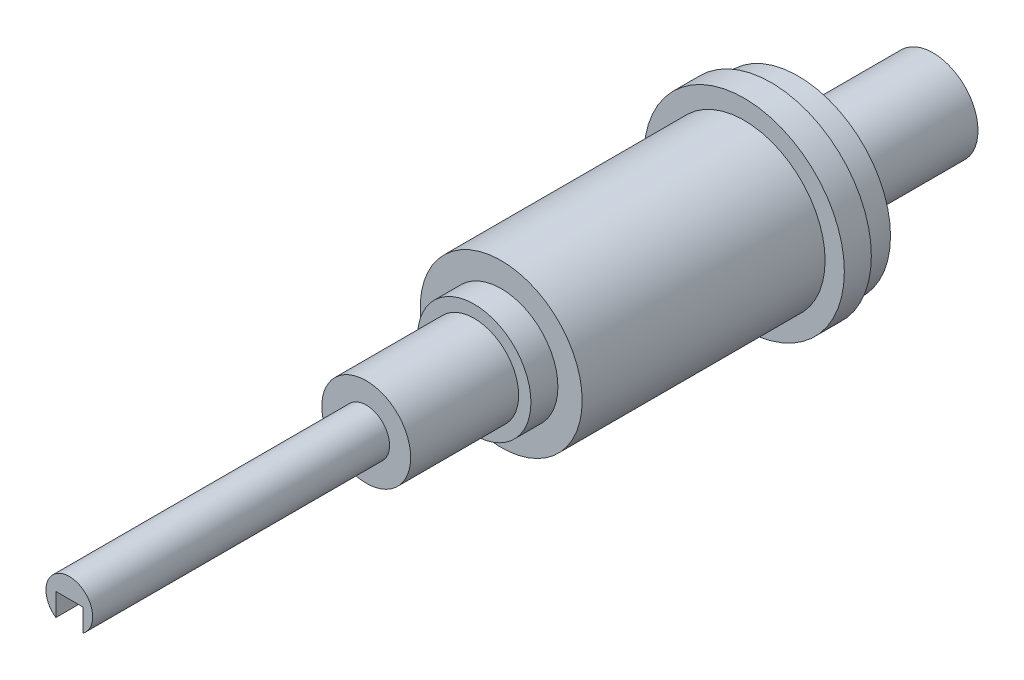
ISO-10303-21;
HEADER;
FILE_DESCRIPTION(('STEP AP214'),'2;1');
FILE_NAME('part.step','',(''),(''),'','','');
FILE_SCHEMA(('AUTOMOTIVE_DESIGN { 1 0 10303 214 1 1 1 1 }'));
ENDSEC;
DATA;
#1=APPLICATION_CONTEXT('core data for automotive mechanical design processes');
#2=APPLICATION_PROTOCOL_DEFINITION('international standard','automotive_design',2000,#1);
#3=PRODUCT_CONTEXT('',#1,'mechanical');
#4=PRODUCT('Part','Part','',(#3));
#5=PRODUCT_RELATED_PRODUCT_CATEGORY('part','',(#4));
#6=PRODUCT_DEFINITION_FORMATION('','',#4);
#7=PRODUCT_DEFINITION_CONTEXT('part definition',#1,'design');
#8=PRODUCT_DEFINITION('design','',#6,#7);
#9=PRODUCT_DEFINITION_SHAPE('','',#8);
#10=(LENGTH_UNIT() NAMED_UNIT(*) SI_UNIT(.MILLI.,.METRE.));
#11=(NAMED_UNIT(*) PLANE_ANGLE_UNIT() SI_UNIT($,.RADIAN.));
#12=(NAMED_UNIT(*) SI_UNIT($,.STERADIAN.) SOLID_ANGLE_UNIT());
#13=UNCERTAINTY_MEASURE_WITH_UNIT(LENGTH_MEASURE(1.E-05),#10,'distance_accuracy_value','');
#14=(GEOMETRIC_REPRESENTATION_CONTEXT(3) GLOBAL_UNCERTAINTY_ASSIGNED_CONTEXT((#13)) GLOBAL_UNIT_ASSIGNED_CONTEXT((#10,
#11,#12)) REPRESENTATION_CONTEXT('',''));
#15=CARTESIAN_POINT('',(0.,0.,0.));
#16=DIRECTION('',(0.,0.,1.));
#17=DIRECTION('',(1.,0.,0.));
#18=AXIS2_PLACEMENT_3D('',#15,#16,#17);
#19=CARTESIAN_POINT('',(0.,0.,0.));
#20=DIRECTION('',(0.,0.,1.));
#21=DIRECTION('',(1.,0.,0.));
#22=AXIS2_PLACEMENT_3D('',#19,#20,#21);
#23=CYLINDRICAL_SURFACE('',#22,19.05);
#24=CARTESIAN_POINT('',(0.,0.,-158.75));
#25=DIRECTION('',(0.,0.,1.));
#26=DIRECTION('',(1.,0.,0.));
#27=AXIS2_PLACEMENT_3D('',#24,#25,#26);
#28=CIRCLE('',#27,19.05);
#29=CARTESIAN_POINT('',(19.05,0.,-158.75));
#30=VERTEX_POINT('',#29);
#31=EDGE_CURVE('E198',#30,#30,#28,.T.);
#32=ORIENTED_EDGE('',*,*,#31,.T.);
#33=EDGE_LOOP('',(#32));
#34=FACE_BOUND('',#33,.T.);
#35=CARTESIAN_POINT('',(0.,0.,-101.6));
#36=DIRECTION('',(0.,0.,1.));
#37=DIRECTION('',(1.,0.,0.));
#38=AXIS2_PLACEMENT_3D('',#35,#36,#37);
#39=CIRCLE('',#38,19.05);
#40=CARTESIAN_POINT('',(19.05,0.,-101.6));
#41=VERTEX_POINT('',#40);
#42=EDGE_CURVE('E202',#41,#41,#39,.T.);
#43=ORIENTED_EDGE('',*,*,#42,.F.);
#44=EDGE_LOOP('',(#43));
#45=FACE_BOUND('',#44,.T.);
#46=CARTESIAN_POINT('',(0.,0.,-152.4));
#47=DIRECTION('',(0.,0.,1.));
#48=DIRECTION('',(1.,0.,0.));
#49=AXIS2_PLACEMENT_3D('',#46,#47,#48);
#50=CIRCLE('',#49,19.05);
#51=CARTESIAN_POINT('',(-3.17500000000001,-18.7835533113413,-152.4));
#52=VERTEX_POINT('',#51);
#53=CARTESIAN_POINT('',(3.175,-18.7835533113413,-152.4));
#54=VERTEX_POINT('',#53);
#55=EDGE_CURVE('E241',#52,#54,#50,.T.);
#56=ORIENTED_EDGE('',*,*,#55,.F.);
#57=DIRECTION('',(0.,0.,1.));
#58=VECTOR('',#57,1.);
#59=CARTESIAN_POINT('',(-3.17499999999996,-18.7835533113413,0.));
#60=LINE('',#59,#58);
#61=CARTESIAN_POINT('',(-3.17499999999999,-18.7835533113413,-114.3));
#62=VERTEX_POINT('',#61);
#63=EDGE_CURVE('E11',#52,#62,#60,.T.);
#64=ORIENTED_EDGE('',*,*,#63,.T.);
#65=CARTESIAN_POINT('',(0.,0.,-114.3));
#66=DIRECTION('',(0.,0.,1.));
#67=DIRECTION('',(1.,0.,0.));
#68=AXIS2_PLACEMENT_3D('',#65,#66,#67);
#69=CIRCLE('',#68,19.05);
#70=CARTESIAN_POINT('',(3.17499999999999,-18.7835533113413,-114.3));
#71=VERTEX_POINT('',#70);
#72=EDGE_CURVE('E50',#62,#71,#69,.T.);
#73=ORIENTED_EDGE('',*,*,#72,.T.);
#74=DIRECTION('',(0.,0.,1.));
#75=VECTOR('',#74,1.);
#76=CARTESIAN_POINT('',(3.17499999999997,-18.7835533113413,0.));
#77=LINE('',#76,#75);
#78=EDGE_CURVE('E244',#54,#71,#77,.T.);
#79=ORIENTED_EDGE('',*,*,#78,.F.);
#80=EDGE_LOOP('',(#56,#64,#73,#79));
#81=FACE_BOUND('',#80,.T.);
#82=ADVANCED_FACE('F41',(#34,#45,#81),#23,.T.);
#83=CARTESIAN_POINT('',(0.,0.,0.));
#84=DIRECTION('',(0.,0.,-1.));
#85=DIRECTION('',(-1.,0.,0.));
#86=AXIS2_PLACEMENT_3D('',#83,#84,#85);
#87=PLANE('',#86);
#88=DIRECTION('',(-1.,0.,0.));
#89=VECTOR('',#88,1.);
#90=CARTESIAN_POINT('',(3.175,0.857757999999997,0.));
#91=LINE('',#90,#89);
#92=CARTESIAN_POINT('',(3.175,0.857757999999997,0.));
#93=VERTEX_POINT('',#92);
#94=CARTESIAN_POINT('',(-3.175,0.857757999999997,0.));
#95=VERTEX_POINT('',#94);
#96=EDGE_CURVE('E148',#93,#95,#91,.T.);
#97=ORIENTED_EDGE('',*,*,#96,.F.);
#98=DIRECTION('',(0.,-1.,0.));
#99=VECTOR('',#98,1.);
#100=CARTESIAN_POINT('',(3.175,0.857757999999997,0.));
#101=LINE('',#100,#99);
#102=CARTESIAN_POINT('',(3.175,-4.48152844312786,0.));
#103=VERTEX_POINT('',#102);
#104=EDGE_CURVE('E160',#93,#103,#101,.T.);
#105=ORIENTED_EDGE('',*,*,#104,.T.);
#106=CARTESIAN_POINT('',(0.,0.,0.));
#107=DIRECTION('',(0.,0.,1.));
#108=DIRECTION('',(1.,0.,0.));
#109=AXIS2_PLACEMENT_3D('',#106,#107,#108);
#110=CIRCLE('',#109,5.492242);
#111=CARTESIAN_POINT('',(-3.175,-4.48152844312786,0.));
#112=VERTEX_POINT('',#111);
#113=EDGE_CURVE('E226',#103,#112,#110,.T.);
#114=ORIENTED_EDGE('',*,*,#113,.T.);
#115=DIRECTION('',(0.,-1.,0.));
#116=VECTOR('',#115,1.);
#117=CARTESIAN_POINT('',(-3.175,0.857757999999997,0.));
#118=LINE('',#117,#116);
#119=EDGE_CURVE('E64',#95,#112,#118,.T.);
#120=ORIENTED_EDGE('',*,*,#119,.F.);
#121=EDGE_LOOP('',(#97,#105,#114,#120));
#122=FACE_BOUND('',#121,.T.);
#123=ADVANCED_FACE('F43',(#122),#87,.F.);
#124=CARTESIAN_POINT('',(0.,0.,0.));
#125=DIRECTION('',(0.,0.,1.));
#126=DIRECTION('',(1.,0.,0.));
#127=AXIS2_PLACEMENT_3D('',#124,#125,#126);
#128=CYLINDRICAL_SURFACE('',#127,5.492242);
#129=ORIENTED_EDGE('',*,*,#113,.F.);
#130=DIRECTION('',(0.,0.,1.));
#131=VECTOR('',#130,1.);
#132=CARTESIAN_POINT('',(3.175,-4.48152844312786,0.));
#133=LINE('',#132,#131);
#134=CARTESIAN_POINT('',(3.175,-4.48152844312786,-50.8));
#135=VERTEX_POINT('',#134);
#136=EDGE_CURVE('E237',#103,#135,#133,.F.);
#137=ORIENTED_EDGE('',*,*,#136,.T.);
#138=CARTESIAN_POINT('',(0.,0.,-50.8));
#139=DIRECTION('',(0.,0.,-1.));
#140=DIRECTION('',(-1.,0.,0.));
#141=AXIS2_PLACEMENT_3D('',#138,#139,#140);
#142=CIRCLE('',#141,5.492242);
#143=CARTESIAN_POINT('',(-3.175,-4.48152844312786,-50.8));
#144=VERTEX_POINT('',#143);
#145=EDGE_CURVE('E230',#135,#144,#142,.T.);
#146=ORIENTED_EDGE('',*,*,#145,.T.);
#147=DIRECTION('',(0.,0.,1.));
#148=VECTOR('',#147,1.);
#149=CARTESIAN_POINT('',(-3.175,-4.48152844312786,0.));
#150=LINE('',#149,#148);
#151=EDGE_CURVE('E234',#144,#112,#150,.T.);
#152=ORIENTED_EDGE('',*,*,#151,.T.);
#153=EDGE_LOOP('',(#129,#137,#146,#152));
#154=FACE_BOUND('',#153,.T.);
#155=CARTESIAN_POINT('',(0.,0.,-69.85));
#156=DIRECTION('',(0.,0.,1.));
#157=DIRECTION('',(1.,0.,0.));
#158=AXIS2_PLACEMENT_3D('',#155,#156,#157);
#159=CIRCLE('',#158,5.49224200000001);
#160=CARTESIAN_POINT('',(5.49224200000001,0.,-69.85));
#161=VERTEX_POINT('',#160);
#162=EDGE_CURVE('E222',#161,#161,#159,.T.);
#163=ORIENTED_EDGE('',*,*,#162,.T.);
#164=EDGE_LOOP('',(#163));
#165=FACE_BOUND('',#164,.T.);
#166=ADVANCED_FACE('F270',(#154,#165),#128,.T.);
#167=CARTESIAN_POINT('',(0.,5.49224200000001,-69.85));
#168=DIRECTION('',(0.,0.,-1.));
#169=DIRECTION('',(-1.,0.,0.));
#170=AXIS2_PLACEMENT_3D('',#167,#168,#169);
#171=PLANE('',#170);
#172=ORIENTED_EDGE('',*,*,#162,.F.);
#173=EDGE_LOOP('',(#172));
#174=FACE_BOUND('',#173,.T.);
#175=CARTESIAN_POINT('',(0.,0.,-69.85));
#176=DIRECTION('',(0.,0.,1.));
#177=DIRECTION('',(1.,0.,0.));
#178=AXIS2_PLACEMENT_3D('',#175,#176,#177);
#179=CIRCLE('',#178,10.4529763);
#180=CARTESIAN_POINT('',(10.4529763,0.,-69.85));
#181=VERTEX_POINT('',#180);
#182=EDGE_CURVE('E218',#181,#181,#179,.T.);
#183=ORIENTED_EDGE('',*,*,#182,.T.);
#184=EDGE_LOOP('',(#183));
#185=FACE_BOUND('',#184,.T.);
#186=ADVANCED_FACE('F292',(#174,#185),#171,.F.);
#187=CARTESIAN_POINT('',(0.,0.,0.));
#188=DIRECTION('',(0.,0.,1.));
#189=DIRECTION('',(1.,0.,0.));
#190=AXIS2_PLACEMENT_3D('',#187,#188,#189);
#191=CYLINDRICAL_SURFACE('',#190,10.4529763);
#192=ORIENTED_EDGE('',*,*,#182,.F.);
#193=EDGE_LOOP('',(#192));
#194=FACE_BOUND('',#193,.T.);
#195=CARTESIAN_POINT('',(0.,0.,-95.25));
#196=DIRECTION('',(0.,0.,1.));
#197=DIRECTION('',(1.,0.,0.));
#198=AXIS2_PLACEMENT_3D('',#195,#196,#197);
#199=CIRCLE('',#198,10.4529763);
#200=CARTESIAN_POINT('',(10.4529763,0.,-95.25));
#201=VERTEX_POINT('',#200);
#202=EDGE_CURVE('E214',#201,#201,#199,.T.);
#203=ORIENTED_EDGE('',*,*,#202,.T.);
#204=EDGE_LOOP('',(#203));
#205=FACE_BOUND('',#204,.T.);
#206=ADVANCED_FACE('F288',(#194,#205),#191,.T.);
#207=CARTESIAN_POINT('',(0.,10.4529763,-95.25));
#208=DIRECTION('',(0.,0.,-1.));
#209=DIRECTION('',(-1.,0.,0.));
#210=AXIS2_PLACEMENT_3D('',#207,#208,#209);
#211=PLANE('',#210);
#212=ORIENTED_EDGE('',*,*,#202,.F.);
#213=EDGE_LOOP('',(#212));
#214=FACE_BOUND('',#213,.T.);
#215=CARTESIAN_POINT('',(0.,0.,-95.25));
#216=DIRECTION('',(0.,0.,1.));
#217=DIRECTION('',(1.,0.,0.));
#218=AXIS2_PLACEMENT_3D('',#215,#216,#217);
#219=CIRCLE('',#218,13.340207);
#220=CARTESIAN_POINT('',(13.340207,0.,-95.25));
#221=VERTEX_POINT('',#220);
#222=EDGE_CURVE('E210',#221,#221,#219,.T.);
#223=ORIENTED_EDGE('',*,*,#222,.T.);
#224=EDGE_LOOP('',(#223));
#225=FACE_BOUND('',#224,.T.);
#226=ADVANCED_FACE('F284',(#214,#225),#211,.F.);
#227=CARTESIAN_POINT('',(0.,0.,0.));
#228=DIRECTION('',(0.,0.,1.));
#229=DIRECTION('',(1.,0.,0.));
#230=AXIS2_PLACEMENT_3D('',#227,#228,#229);
#231=CYLINDRICAL_SURFACE('',#230,13.340207);
#232=ORIENTED_EDGE('',*,*,#222,.F.);
#233=EDGE_LOOP('',(#232));
#234=FACE_BOUND('',#233,.T.);
#235=CARTESIAN_POINT('',(0.,0.,-101.6));
#236=DIRECTION('',(0.,0.,1.));
#237=DIRECTION('',(1.,0.,0.));
#238=AXIS2_PLACEMENT_3D('',#235,#236,#237);
#239=CIRCLE('',#238,13.340207);
#240=CARTESIAN_POINT('',(13.340207,0.,-101.6));
#241=VERTEX_POINT('',#240);
#242=EDGE_CURVE('E206',#241,#241,#239,.T.);
#243=ORIENTED_EDGE('',*,*,#242,.T.);
#244=EDGE_LOOP('',(#243));
#245=FACE_BOUND('',#244,.T.);
#246=ADVANCED_FACE('F280',(#234,#245),#231,.T.);
#247=CARTESIAN_POINT('',(0.,13.340207,-101.6));
#248=DIRECTION('',(0.,0.,-1.));
#249=DIRECTION('',(-1.,0.,0.));
#250=AXIS2_PLACEMENT_3D('',#247,#248,#249);
#251=PLANE('',#250);
#252=ORIENTED_EDGE('',*,*,#242,.F.);
#253=EDGE_LOOP('',(#252));
#254=FACE_BOUND('',#253,.T.);
#255=ORIENTED_EDGE('',*,*,#42,.T.);
#256=EDGE_LOOP('',(#255));
#257=FACE_BOUND('',#256,.T.);
#258=ADVANCED_FACE('F277',(#254,#257),#251,.F.);
#259=CARTESIAN_POINT('',(0.,19.05,-158.75));
#260=DIRECTION('',(0.,0.,-1.));
#261=DIRECTION('',(-1.,0.,0.));
#262=AXIS2_PLACEMENT_3D('',#259,#260,#261);
#263=PLANE('',#262);
#264=ORIENTED_EDGE('',*,*,#31,.F.);
#265=EDGE_LOOP('',(#264));
#266=FACE_BOUND('',#265,.T.);
#267=CARTESIAN_POINT('',(0.,0.,-158.75));
#268=DIRECTION('',(0.,0.,1.));
#269=DIRECTION('',(1.,0.,0.));
#270=AXIS2_PLACEMENT_3D('',#267,#268,#269);
#271=CIRCLE('',#270,23.579455);
#272=CARTESIAN_POINT('',(23.579455,0.,-158.75));
#273=VERTEX_POINT('',#272);
#274=EDGE_CURVE('E194',#273,#273,#271,.T.);
#275=ORIENTED_EDGE('',*,*,#274,.T.);
#276=EDGE_LOOP('',(#275));
#277=FACE_BOUND('',#276,.T.);
#278=ADVANCED_FACE('F275',(#266,#277),#263,.F.);
#279=CARTESIAN_POINT('',(0.,0.,0.));
#280=DIRECTION('',(0.,0.,1.));
#281=DIRECTION('',(1.,0.,0.));
#282=AXIS2_PLACEMENT_3D('',#279,#280,#281);
#283=CYLINDRICAL_SURFACE('',#282,23.579455);
#284=ORIENTED_EDGE('',*,*,#274,.F.);
#285=EDGE_LOOP('',(#284));
#286=FACE_BOUND('',#285,.T.);
#287=CARTESIAN_POINT('',(0.,0.,-165.1));
#288=DIRECTION('',(0.,0.,1.));
#289=DIRECTION('',(1.,0.,0.));
#290=AXIS2_PLACEMENT_3D('',#287,#288,#289);
#291=CIRCLE('',#290,23.579455);
#292=CARTESIAN_POINT('',(23.579455,0.,-165.1));
#293=VERTEX_POINT('',#292);
#294=EDGE_CURVE('E190',#293,#293,#291,.T.);
#295=ORIENTED_EDGE('',*,*,#294,.T.);
#296=EDGE_LOOP('',(#295));
#297=FACE_BOUND('',#296,.T.);
#298=ADVANCED_FACE('F351',(#286,#297),#283,.T.);
#299=CARTESIAN_POINT('',(0.,23.579455,-165.1));
#300=DIRECTION('',(0.,0.,1.));
#301=DIRECTION('',(1.,0.,0.));
#302=AXIS2_PLACEMENT_3D('',#299,#300,#301);
#303=PLANE('',#302);
#304=ORIENTED_EDGE('',*,*,#294,.F.);
#305=EDGE_LOOP('',(#304));
#306=FACE_BOUND('',#305,.T.);
#307=CARTESIAN_POINT('',(0.,0.,-165.1));
#308=DIRECTION('',(0.,0.,1.));
#309=DIRECTION('',(1.,0.,0.));
#310=AXIS2_PLACEMENT_3D('',#307,#308,#309);
#311=CIRCLE('',#310,21.735161);
#312=CARTESIAN_POINT('',(21.735161,0.,-165.1));
#313=VERTEX_POINT('',#312);
#314=EDGE_CURVE('E186',#313,#313,#311,.T.);
#315=ORIENTED_EDGE('',*,*,#314,.T.);
#316=EDGE_LOOP('',(#315));
#317=FACE_BOUND('',#316,.T.);
#318=ADVANCED_FACE('F348',(#306,#317),#303,.F.);
#319=CARTESIAN_POINT('',(0.,0.,0.));
#320=DIRECTION('',(0.,0.,1.));
#321=DIRECTION('',(1.,0.,0.));
#322=AXIS2_PLACEMENT_3D('',#319,#320,#321);
#323=CYLINDRICAL_SURFACE('',#322,21.735161);
#324=ORIENTED_EDGE('',*,*,#314,.F.);
#325=EDGE_LOOP('',(#324));
#326=FACE_BOUND('',#325,.T.);
#327=CARTESIAN_POINT('',(0.,0.,-171.45));
#328=DIRECTION('',(0.,0.,1.));
#329=DIRECTION('',(1.,0.,0.));
#330=AXIS2_PLACEMENT_3D('',#327,#328,#329);
#331=CIRCLE('',#330,21.735161);
#332=CARTESIAN_POINT('',(21.735161,0.,-171.45));
#333=VERTEX_POINT('',#332);
#334=EDGE_CURVE('E182',#333,#333,#331,.T.);
#335=ORIENTED_EDGE('',*,*,#334,.T.);
#336=EDGE_LOOP('',(#335));
#337=FACE_BOUND('',#336,.T.);
#338=ADVANCED_FACE('F344',(#326,#337),#323,.T.);
#339=CARTESIAN_POINT('',(0.,21.735161,-171.45));
#340=DIRECTION('',(0.,0.,1.));
#341=DIRECTION('',(1.,0.,0.));
#342=AXIS2_PLACEMENT_3D('',#339,#340,#341);
#343=PLANE('',#342);
#344=ORIENTED_EDGE('',*,*,#334,.F.);
#345=EDGE_LOOP('',(#344));
#346=FACE_BOUND('',#345,.T.);
#347=CARTESIAN_POINT('',(0.,0.,-171.45));
#348=DIRECTION('',(0.,0.,1.));
#349=DIRECTION('',(1.,0.,0.));
#350=AXIS2_PLACEMENT_3D('',#347,#348,#349);
#351=CIRCLE('',#350,10.5689654);
#352=CARTESIAN_POINT('',(10.5689654,0.,-171.45));
#353=VERTEX_POINT('',#352);
#354=EDGE_CURVE('E178',#353,#353,#351,.T.);
#355=ORIENTED_EDGE('',*,*,#354,.T.);
#356=EDGE_LOOP('',(#355));
#357=FACE_BOUND('',#356,.T.);
#358=ADVANCED_FACE('F340',(#346,#357),#343,.F.);
#359=CARTESIAN_POINT('',(0.,0.,0.));
#360=DIRECTION('',(0.,0.,1.));
#361=DIRECTION('',(1.,0.,0.));
#362=AXIS2_PLACEMENT_3D('',#359,#360,#361);
#363=CYLINDRICAL_SURFACE('',#362,10.5689654);
#364=ORIENTED_EDGE('',*,*,#354,.F.);
#365=EDGE_LOOP('',(#364));
#366=FACE_BOUND('',#365,.T.);
#367=CARTESIAN_POINT('',(0.,0.,-203.2));
#368=DIRECTION('',(0.,0.,1.));
#369=DIRECTION('',(1.,0.,0.));
#370=AXIS2_PLACEMENT_3D('',#367,#368,#369);
#371=CIRCLE('',#370,10.5689654);
#372=CARTESIAN_POINT('',(10.5689654,0.,-203.2));
#373=VERTEX_POINT('',#372);
#374=EDGE_CURVE('E165',#373,#373,#371,.T.);
#375=ORIENTED_EDGE('',*,*,#374,.T.);
#376=EDGE_LOOP('',(#375));
#377=FACE_BOUND('',#376,.T.);
#378=ADVANCED_FACE('F336',(#366,#377),#363,.T.);
#379=CARTESIAN_POINT('',(0.,10.5689654,-203.2));
#380=DIRECTION('',(0.,0.,1.));
#381=DIRECTION('',(1.,0.,0.));
#382=AXIS2_PLACEMENT_3D('',#379,#380,#381);
#383=PLANE('',#382);
#384=ORIENTED_EDGE('',*,*,#374,.F.);
#385=EDGE_LOOP('',(#384));
#386=FACE_BOUND('',#385,.T.);
#387=ADVANCED_FACE('F333',(#386),#383,.F.);
#388=CARTESIAN_POINT('',(3.175,0.857757999999997,0.));
#389=DIRECTION('',(1.,0.,0.));
#390=DIRECTION('',(0.,0.,-1.));
#391=AXIS2_PLACEMENT_3D('',#388,#389,#390);
#392=PLANE('',#391);
#393=ORIENTED_EDGE('',*,*,#104,.F.);
#394=DIRECTION('',(0.,0.,1.));
#395=VECTOR('',#394,1.);
#396=CARTESIAN_POINT('',(3.175,0.857757999999997,0.));
#397=LINE('',#396,#395);
#398=CARTESIAN_POINT('',(3.175,0.857757999999997,-50.8));
#399=VERTEX_POINT('',#398);
#400=EDGE_CURVE('E138',#399,#93,#397,.T.);
#401=ORIENTED_EDGE('',*,*,#400,.F.);
#402=DIRECTION('',(0.,-1.,0.));
#403=VECTOR('',#402,1.);
#404=CARTESIAN_POINT('',(3.175,0.857757999999997,-50.8));
#405=LINE('',#404,#403);
#406=EDGE_CURVE('E161',#399,#135,#405,.T.);
#407=ORIENTED_EDGE('',*,*,#406,.T.);
#408=ORIENTED_EDGE('',*,*,#136,.F.);
#409=EDGE_LOOP('',(#393,#401,#407,#408));
#410=FACE_BOUND('',#409,.T.);
#411=ADVANCED_FACE('F316',(#410),#392,.F.);
#412=CARTESIAN_POINT('',(3.175,0.857757999999997,-50.8));
#413=DIRECTION('',(0.,0.,-1.));
#414=DIRECTION('',(-1.,0.,0.));
#415=AXIS2_PLACEMENT_3D('',#412,#413,#414);
#416=PLANE('',#415);
#417=ORIENTED_EDGE('',*,*,#406,.F.);
#418=DIRECTION('',(1.,0.,0.));
#419=VECTOR('',#418,1.);
#420=CARTESIAN_POINT('',(3.175,0.857757999999997,-50.8));
#421=LINE('',#420,#419);
#422=CARTESIAN_POINT('',(-3.175,0.857757999999997,-50.8));
#423=VERTEX_POINT('',#422);
#424=EDGE_CURVE('E156',#423,#399,#421,.T.);
#425=ORIENTED_EDGE('',*,*,#424,.F.);
#426=DIRECTION('',(0.,-1.,0.));
#427=VECTOR('',#426,1.);
#428=CARTESIAN_POINT('',(-3.175,0.857757999999997,-50.8));
#429=LINE('',#428,#427);
#430=EDGE_CURVE('E166',#423,#144,#429,.T.);
#431=ORIENTED_EDGE('',*,*,#430,.T.);
#432=ORIENTED_EDGE('',*,*,#145,.F.);
#433=EDGE_LOOP('',(#417,#425,#431,#432));
#434=FACE_BOUND('',#433,.T.);
#435=ADVANCED_FACE('F320',(#434),#416,.F.);
#436=CARTESIAN_POINT('',(-3.175,0.857757999999997,0.));
#437=DIRECTION('',(-1.,0.,0.));
#438=DIRECTION('',(0.,0.,1.));
#439=AXIS2_PLACEMENT_3D('',#436,#437,#438);
#440=PLANE('',#439);
#441=ORIENTED_EDGE('',*,*,#430,.F.);
#442=DIRECTION('',(0.,0.,-1.));
#443=VECTOR('',#442,1.);
#444=CARTESIAN_POINT('',(-3.175,0.857757999999997,0.));
#445=LINE('',#444,#443);
#446=EDGE_CURVE('E152',#95,#423,#445,.T.);
#447=ORIENTED_EDGE('',*,*,#446,.F.);
#448=ORIENTED_EDGE('',*,*,#119,.T.);
#449=ORIENTED_EDGE('',*,*,#151,.F.);
#450=EDGE_LOOP('',(#441,#447,#448,#449));
#451=FACE_BOUND('',#450,.T.);
#452=ADVANCED_FACE('F321',(#451),#440,.F.);
#453=CARTESIAN_POINT('',(0.,0.857757999999997,0.));
#454=DIRECTION('',(0.,1.,0.));
#455=DIRECTION('',(0.,0.,1.));
#456=AXIS2_PLACEMENT_3D('',#453,#454,#455);
#457=PLANE('',#456);
#458=ORIENTED_EDGE('',*,*,#400,.T.);
#459=ORIENTED_EDGE('',*,*,#96,.T.);
#460=ORIENTED_EDGE('',*,*,#446,.T.);
#461=ORIENTED_EDGE('',*,*,#424,.T.);
#462=EDGE_LOOP('',(#458,#459,#460,#461));
#463=FACE_BOUND('',#462,.T.);
#464=ADVANCED_FACE('F261',(#463),#457,.F.);
#465=CARTESIAN_POINT('',(3.17499999999999,-12.7,-114.3));
#466=DIRECTION('',(0.,0.,1.));
#467=DIRECTION('',(1.,0.,0.));
#468=AXIS2_PLACEMENT_3D('',#465,#466,#467);
#469=PLANE('',#468);
#470=DIRECTION('',(0.,-1.,0.));
#471=VECTOR('',#470,1.);
#472=CARTESIAN_POINT('',(-3.17499999999999,-12.7,-114.3));
#473=LINE('',#472,#471);
#474=CARTESIAN_POINT('',(-3.17499999999999,-12.7,-114.3));
#475=VERTEX_POINT('',#474);
#476=EDGE_CURVE('E105',#475,#62,#473,.T.);
#477=ORIENTED_EDGE('',*,*,#476,.F.);
#478=DIRECTION('',(-1.,0.,0.));
#479=VECTOR('',#478,1.);
#480=CARTESIAN_POINT('',(3.17499999999999,-12.7,-114.3));
#481=LINE('',#480,#479);
#482=CARTESIAN_POINT('',(3.17499999999999,-12.7,-114.3));
#483=VERTEX_POINT('',#482);
#484=EDGE_CURVE('E109',#483,#475,#481,.T.);
#485=ORIENTED_EDGE('',*,*,#484,.F.);
#486=DIRECTION('',(0.,-1.,0.));
#487=VECTOR('',#486,1.);
#488=CARTESIAN_POINT('',(3.17499999999999,-12.7,-114.3));
#489=LINE('',#488,#487);
#490=EDGE_CURVE('E135',#483,#71,#489,.T.);
#491=ORIENTED_EDGE('',*,*,#490,.T.);
#492=ORIENTED_EDGE('',*,*,#72,.F.);
#493=EDGE_LOOP('',(#477,#485,#491,#492));
#494=FACE_BOUND('',#493,.T.);
#495=ADVANCED_FACE('F107',(#494),#469,.F.);
#496=CARTESIAN_POINT('',(3.17499999999999,-12.7,-114.3));
#497=DIRECTION('',(-1.,0.,0.));
#498=DIRECTION('',(0.,0.,1.));
#499=AXIS2_PLACEMENT_3D('',#496,#497,#498);
#500=PLANE('',#499);
#501=ORIENTED_EDGE('',*,*,#78,.T.);
#502=ORIENTED_EDGE('',*,*,#490,.F.);
#503=DIRECTION('',(0.,0.,-1.));
#504=VECTOR('',#503,1.);
#505=CARTESIAN_POINT('',(3.17499999999999,-12.7,-114.3));
#506=LINE('',#505,#504);
#507=CARTESIAN_POINT('',(3.175,-12.7,-152.4));
#508=VERTEX_POINT('',#507);
#509=EDGE_CURVE('E114',#483,#508,#506,.T.);
#510=ORIENTED_EDGE('',*,*,#509,.T.);
#511=DIRECTION('',(0.,-1.,0.));
#512=VECTOR('',#511,1.);
#513=CARTESIAN_POINT('',(3.175,-12.7,-152.4));
#514=LINE('',#513,#512);
#515=EDGE_CURVE('E139',#508,#54,#514,.T.);
#516=ORIENTED_EDGE('',*,*,#515,.T.);
#517=EDGE_LOOP('',(#501,#502,#510,#516));
#518=FACE_BOUND('',#517,.T.);
#519=ADVANCED_FACE('F253',(#518),#500,.T.);
#520=CARTESIAN_POINT('',(3.175,-12.7,-152.4));
#521=DIRECTION('',(0.,0.,1.));
#522=DIRECTION('',(1.,0.,0.));
#523=AXIS2_PLACEMENT_3D('',#520,#521,#522);
#524=PLANE('',#523);
#525=DIRECTION('',(0.,-1.,0.));
#526=VECTOR('',#525,1.);
#527=CARTESIAN_POINT('',(-3.17500000000001,-12.7,-152.4));
#528=LINE('',#527,#526);
#529=CARTESIAN_POINT('',(-3.17500000000001,-12.7,-152.4));
#530=VERTEX_POINT('',#529);
#531=EDGE_CURVE('E113',#530,#52,#528,.T.);
#532=ORIENTED_EDGE('',*,*,#531,.T.);
#533=ORIENTED_EDGE('',*,*,#55,.T.);
#534=ORIENTED_EDGE('',*,*,#515,.F.);
#535=DIRECTION('',(-1.,0.,0.));
#536=VECTOR('',#535,1.);
#537=CARTESIAN_POINT('',(3.175,-12.7,-152.4));
#538=LINE('',#537,#536);
#539=EDGE_CURVE('E124',#508,#530,#538,.T.);
#540=ORIENTED_EDGE('',*,*,#539,.T.);
#541=EDGE_LOOP('',(#532,#533,#534,#540));
#542=FACE_BOUND('',#541,.T.);
#543=ADVANCED_FACE('F250',(#542),#524,.T.);
#544=CARTESIAN_POINT('',(-3.17499999999999,-12.7,-114.3));
#545=DIRECTION('',(-1.,0.,0.));
#546=DIRECTION('',(0.,0.,1.));
#547=AXIS2_PLACEMENT_3D('',#544,#545,#546);
#548=PLANE('',#547);
#549=ORIENTED_EDGE('',*,*,#531,.F.);
#550=DIRECTION('',(0.,0.,-1.));
#551=VECTOR('',#550,1.);
#552=CARTESIAN_POINT('',(-3.17499999999999,-12.7,-114.3));
#553=LINE('',#552,#551);
#554=EDGE_CURVE('E118',#475,#530,#553,.T.);
#555=ORIENTED_EDGE('',*,*,#554,.F.);
#556=ORIENTED_EDGE('',*,*,#476,.T.);
#557=ORIENTED_EDGE('',*,*,#63,.F.);
#558=EDGE_LOOP('',(#549,#555,#556,#557));
#559=FACE_BOUND('',#558,.T.);
#560=ADVANCED_FACE('F119',(#559),#548,.F.);
#561=CARTESIAN_POINT('',(0.,-12.7,0.));
#562=DIRECTION('',(0.,-1.,0.));
#563=DIRECTION('',(0.,0.,-1.));
#564=AXIS2_PLACEMENT_3D('',#561,#562,#563);
#565=PLANE('',#564);
#566=ORIENTED_EDGE('',*,*,#484,.T.);
#567=ORIENTED_EDGE('',*,*,#554,.T.);
#568=ORIENTED_EDGE('',*,*,#539,.F.);
#569=ORIENTED_EDGE('',*,*,#509,.F.);
#570=EDGE_LOOP('',(#566,#567,#568,#569));
#571=FACE_BOUND('',#570,.T.);
#572=ADVANCED_FACE('F127',(#571),#565,.T.);
#573=CLOSED_SHELL('',(#82,#123,#166,#186,#206,#226,#246,#258,#278,#298,#318,#338,#358,#378,#387,
#411,#435,#452,#464,#495,#519,#543,#560,#572));
#574=MANIFOLD_SOLID_BREP('B2',#573);
#575=ADVANCED_BREP_SHAPE_REPRESENTATION('',(#18,#574),#14);
#576=SHAPE_DEFINITION_REPRESENTATION(#9,#575);
ENDSEC;
END-ISO-10303-21;
